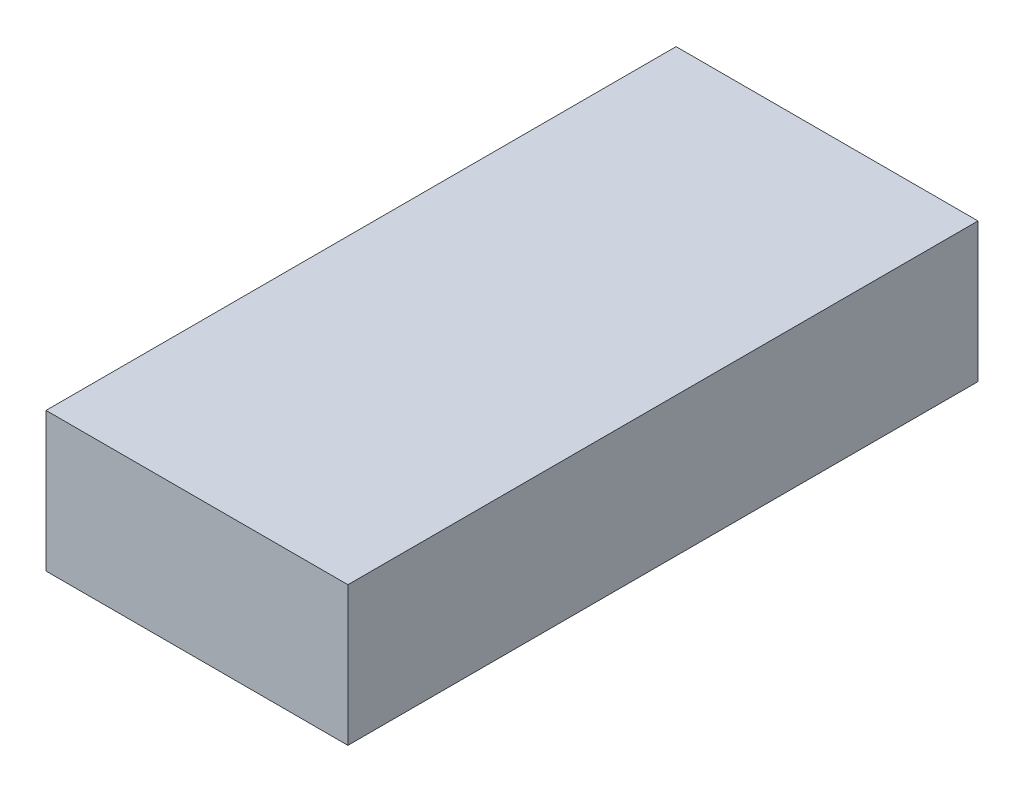
ISO-10303-21;
HEADER;
FILE_DESCRIPTION(('STEP AP214'),'2;1');
FILE_NAME('part.step','',(''),(''),'','','');
FILE_SCHEMA(('AUTOMOTIVE_DESIGN { 1 0 10303 214 1 1 1 1 }'));
ENDSEC;
DATA;
#1=APPLICATION_CONTEXT('core data for automotive mechanical design processes');
#2=APPLICATION_PROTOCOL_DEFINITION('international standard','automotive_design',2000,#1);
#3=PRODUCT_CONTEXT('',#1,'mechanical');
#4=PRODUCT('Part','Part','',(#3));
#5=PRODUCT_RELATED_PRODUCT_CATEGORY('part','',(#4));
#6=PRODUCT_DEFINITION_FORMATION('','',#4);
#7=PRODUCT_DEFINITION_CONTEXT('part definition',#1,'design');
#8=PRODUCT_DEFINITION('design','',#6,#7);
#9=PRODUCT_DEFINITION_SHAPE('','',#8);
#10=(LENGTH_UNIT() NAMED_UNIT(*) SI_UNIT(.MILLI.,.METRE.));
#11=(NAMED_UNIT(*) PLANE_ANGLE_UNIT() SI_UNIT($,.RADIAN.));
#12=(NAMED_UNIT(*) SI_UNIT($,.STERADIAN.) SOLID_ANGLE_UNIT());
#13=UNCERTAINTY_MEASURE_WITH_UNIT(LENGTH_MEASURE(1.E-05),#10,'distance_accuracy_value','');
#14=(GEOMETRIC_REPRESENTATION_CONTEXT(3) GLOBAL_UNCERTAINTY_ASSIGNED_CONTEXT((#13)) GLOBAL_UNIT_ASSIGNED_CONTEXT((#10,
#11,#12)) REPRESENTATION_CONTEXT('',''));
#15=CARTESIAN_POINT('',(0.,0.,0.));
#16=DIRECTION('',(0.,0.,1.));
#17=DIRECTION('',(1.,0.,0.));
#18=AXIS2_PLACEMENT_3D('',#15,#16,#17);
#19=CARTESIAN_POINT('',(-57.5,53.,120.));
#20=DIRECTION('',(1.,0.,0.));
#21=DIRECTION('',(0.,0.,-1.));
#22=AXIS2_PLACEMENT_3D('',#19,#20,#21);
#23=PLANE('',#22);
#24=DIRECTION('',(0.,0.,1.));
#25=VECTOR('',#24,1.);
#26=CARTESIAN_POINT('',(-57.5,0.,120.));
#27=LINE('',#26,#25);
#28=CARTESIAN_POINT('',(-57.5,0.,-120.));
#29=VERTEX_POINT('',#28);
#30=CARTESIAN_POINT('',(-57.5,0.,120.));
#31=VERTEX_POINT('',#30);
#32=EDGE_CURVE('E97',#29,#31,#27,.T.);
#33=ORIENTED_EDGE('',*,*,#32,.T.);
#34=DIRECTION('',(0.,-1.,0.));
#35=VECTOR('',#34,1.);
#36=CARTESIAN_POINT('',(-57.5,53.,120.));
#37=LINE('',#36,#35);
#38=CARTESIAN_POINT('',(-57.5,53.,120.));
#39=VERTEX_POINT('',#38);
#40=EDGE_CURVE('E11',#39,#31,#37,.T.);
#41=ORIENTED_EDGE('',*,*,#40,.F.);
#42=DIRECTION('',(0.,0.,1.));
#43=VECTOR('',#42,1.);
#44=CARTESIAN_POINT('',(-57.5,53.,120.));
#45=LINE('',#44,#43);
#46=CARTESIAN_POINT('',(-57.5,53.,-120.));
#47=VERTEX_POINT('',#46);
#48=EDGE_CURVE('E85',#47,#39,#45,.T.);
#49=ORIENTED_EDGE('',*,*,#48,.F.);
#50=DIRECTION('',(0.,-1.,0.));
#51=VECTOR('',#50,1.);
#52=CARTESIAN_POINT('',(-57.5,53.,-120.));
#53=LINE('',#52,#51);
#54=EDGE_CURVE('E93',#47,#29,#53,.T.);
#55=ORIENTED_EDGE('',*,*,#54,.T.);
#56=EDGE_LOOP('',(#33,#41,#49,#55));
#57=FACE_BOUND('',#56,.T.);
#58=ADVANCED_FACE('F34',(#57),#23,.F.);
#59=CARTESIAN_POINT('',(57.5,53.,120.));
#60=DIRECTION('',(0.,0.,-1.));
#61=DIRECTION('',(-1.,0.,0.));
#62=AXIS2_PLACEMENT_3D('',#59,#60,#61);
#63=PLANE('',#62);
#64=DIRECTION('',(1.,0.,0.));
#65=VECTOR('',#64,1.);
#66=CARTESIAN_POINT('',(57.5,0.,120.));
#67=LINE('',#66,#65);
#68=CARTESIAN_POINT('',(57.5,0.,120.));
#69=VERTEX_POINT('',#68);
#70=EDGE_CURVE('E89',#31,#69,#67,.T.);
#71=ORIENTED_EDGE('',*,*,#70,.T.);
#72=DIRECTION('',(0.,-1.,0.));
#73=VECTOR('',#72,1.);
#74=CARTESIAN_POINT('',(57.5,53.,120.));
#75=LINE('',#74,#73);
#76=CARTESIAN_POINT('',(57.5,53.,120.));
#77=VERTEX_POINT('',#76);
#78=EDGE_CURVE('E42',#77,#69,#75,.T.);
#79=ORIENTED_EDGE('',*,*,#78,.F.);
#80=DIRECTION('',(1.,0.,0.));
#81=VECTOR('',#80,1.);
#82=CARTESIAN_POINT('',(57.5,53.,120.));
#83=LINE('',#82,#81);
#84=EDGE_CURVE('E80',#39,#77,#83,.T.);
#85=ORIENTED_EDGE('',*,*,#84,.F.);
#86=ORIENTED_EDGE('',*,*,#40,.T.);
#87=EDGE_LOOP('',(#71,#79,#85,#86));
#88=FACE_BOUND('',#87,.T.);
#89=ADVANCED_FACE('F88',(#88),#63,.F.);
#90=CARTESIAN_POINT('',(57.5,53.,120.));
#91=DIRECTION('',(-1.,0.,0.));
#92=DIRECTION('',(0.,0.,1.));
#93=AXIS2_PLACEMENT_3D('',#90,#91,#92);
#94=PLANE('',#93);
#95=DIRECTION('',(0.,0.,-1.));
#96=VECTOR('',#95,1.);
#97=CARTESIAN_POINT('',(57.5,0.,120.));
#98=LINE('',#97,#96);
#99=CARTESIAN_POINT('',(57.5,0.,-120.));
#100=VERTEX_POINT('',#99);
#101=EDGE_CURVE('E67',#69,#100,#98,.T.);
#102=ORIENTED_EDGE('',*,*,#101,.T.);
#103=DIRECTION('',(0.,-1.,0.));
#104=VECTOR('',#103,1.);
#105=CARTESIAN_POINT('',(57.5,53.,-120.));
#106=LINE('',#105,#104);
#107=CARTESIAN_POINT('',(57.5,53.,-120.));
#108=VERTEX_POINT('',#107);
#109=EDGE_CURVE('E90',#108,#100,#106,.T.);
#110=ORIENTED_EDGE('',*,*,#109,.F.);
#111=DIRECTION('',(0.,0.,-1.));
#112=VECTOR('',#111,1.);
#113=CARTESIAN_POINT('',(57.5,53.,120.));
#114=LINE('',#113,#112);
#115=EDGE_CURVE('E83',#77,#108,#114,.T.);
#116=ORIENTED_EDGE('',*,*,#115,.F.);
#117=ORIENTED_EDGE('',*,*,#78,.T.);
#118=EDGE_LOOP('',(#102,#110,#116,#117));
#119=FACE_BOUND('',#118,.T.);
#120=ADVANCED_FACE('F91',(#119),#94,.F.);
#121=CARTESIAN_POINT('',(57.5,53.,-120.));
#122=DIRECTION('',(0.,0.,1.));
#123=DIRECTION('',(1.,0.,0.));
#124=AXIS2_PLACEMENT_3D('',#121,#122,#123);
#125=PLANE('',#124);
#126=DIRECTION('',(-1.,0.,0.));
#127=VECTOR('',#126,1.);
#128=CARTESIAN_POINT('',(57.5,0.,-120.));
#129=LINE('',#128,#127);
#130=EDGE_CURVE('E73',#100,#29,#129,.T.);
#131=ORIENTED_EDGE('',*,*,#130,.T.);
#132=ORIENTED_EDGE('',*,*,#54,.F.);
#133=DIRECTION('',(-1.,0.,0.));
#134=VECTOR('',#133,1.);
#135=CARTESIAN_POINT('',(57.5,53.,-120.));
#136=LINE('',#135,#134);
#137=EDGE_CURVE('E50',#108,#47,#136,.T.);
#138=ORIENTED_EDGE('',*,*,#137,.F.);
#139=ORIENTED_EDGE('',*,*,#109,.T.);
#140=EDGE_LOOP('',(#131,#132,#138,#139));
#141=FACE_BOUND('',#140,.T.);
#142=ADVANCED_FACE('F104',(#141),#125,.F.);
#143=CARTESIAN_POINT('',(0.,53.,0.));
#144=DIRECTION('',(0.,1.,0.));
#145=DIRECTION('',(0.,0.,1.));
#146=AXIS2_PLACEMENT_3D('',#143,#144,#145);
#147=PLANE('',#146);
#148=ORIENTED_EDGE('',*,*,#48,.T.);
#149=ORIENTED_EDGE('',*,*,#84,.T.);
#150=ORIENTED_EDGE('',*,*,#115,.T.);
#151=ORIENTED_EDGE('',*,*,#137,.T.);
#152=EDGE_LOOP('',(#148,#149,#150,#151));
#153=FACE_BOUND('',#152,.T.);
#154=ADVANCED_FACE('F81',(#153),#147,.T.);
#155=CARTESIAN_POINT('',(0.,0.,0.));
#156=DIRECTION('',(0.,1.,0.));
#157=DIRECTION('',(0.,0.,1.));
#158=AXIS2_PLACEMENT_3D('',#155,#156,#157);
#159=PLANE('',#158);
#160=ORIENTED_EDGE('',*,*,#32,.F.);
#161=ORIENTED_EDGE('',*,*,#130,.F.);
#162=ORIENTED_EDGE('',*,*,#101,.F.);
#163=ORIENTED_EDGE('',*,*,#70,.F.);
#164=EDGE_LOOP('',(#160,#161,#162,#163));
#165=FACE_BOUND('',#164,.T.);
#166=ADVANCED_FACE('F107',(#165),#159,.F.);
#167=CLOSED_SHELL('',(#58,#89,#120,#142,#154,#166));
#168=MANIFOLD_SOLID_BREP('B2',#167);
#169=ADVANCED_BREP_SHAPE_REPRESENTATION('',(#18,#168),#14);
#170=SHAPE_DEFINITION_REPRESENTATION(#9,#169);
ENDSEC;
END-ISO-10303-21;
